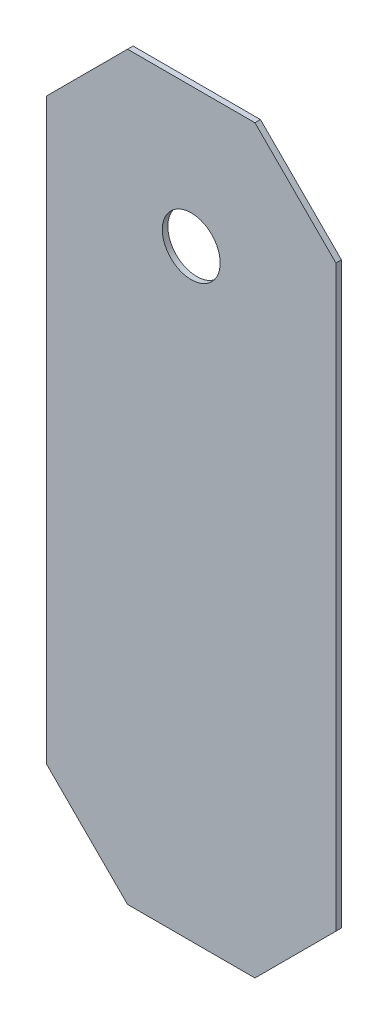
ISO-10303-21;
HEADER;
FILE_DESCRIPTION(('STEP AP214'),'2;1');
FILE_NAME('part.step','',(''),(''),'','','');
FILE_SCHEMA(('AUTOMOTIVE_DESIGN { 1 0 10303 214 1 1 1 1 }'));
ENDSEC;
DATA;
#1=APPLICATION_CONTEXT('core data for automotive mechanical design processes');
#2=APPLICATION_PROTOCOL_DEFINITION('international standard','automotive_design',2000,#1);
#3=PRODUCT_CONTEXT('',#1,'mechanical');
#4=PRODUCT('Part','Part','',(#3));
#5=PRODUCT_RELATED_PRODUCT_CATEGORY('part','',(#4));
#6=PRODUCT_DEFINITION_FORMATION('','',#4);
#7=PRODUCT_DEFINITION_CONTEXT('part definition',#1,'design');
#8=PRODUCT_DEFINITION('design','',#6,#7);
#9=PRODUCT_DEFINITION_SHAPE('','',#8);
#10=(LENGTH_UNIT() NAMED_UNIT(*) SI_UNIT(.MILLI.,.METRE.));
#11=(NAMED_UNIT(*) PLANE_ANGLE_UNIT() SI_UNIT($,.RADIAN.));
#12=(NAMED_UNIT(*) SI_UNIT($,.STERADIAN.) SOLID_ANGLE_UNIT());
#13=UNCERTAINTY_MEASURE_WITH_UNIT(LENGTH_MEASURE(1.E-05),#10,'distance_accuracy_value','');
#14=(GEOMETRIC_REPRESENTATION_CONTEXT(3) GLOBAL_UNCERTAINTY_ASSIGNED_CONTEXT((#13)) GLOBAL_UNIT_ASSIGNED_CONTEXT((#10,
#11,#12)) REPRESENTATION_CONTEXT('',''));
#15=CARTESIAN_POINT('',(0.,0.,0.));
#16=DIRECTION('',(0.,0.,1.));
#17=DIRECTION('',(1.,0.,0.));
#18=AXIS2_PLACEMENT_3D('',#15,#16,#17);
#19=CARTESIAN_POINT('',(-105.,640.774079522774,4.));
#20=DIRECTION('',(0.,0.,1.));
#21=DIRECTION('',(1.,0.,0.));
#22=AXIS2_PLACEMENT_3D('',#19,#20,#21);
#23=PLANE('',#22);
#24=DIRECTION('',(0.,-1.,0.));
#25=VECTOR('',#24,1.);
#26=CARTESIAN_POINT('',(-105.,539.996445797992,4.));
#27=LINE('',#26,#25);
#28=CARTESIAN_POINT('',(-105.,581.996445797992,4.));
#29=VERTEX_POINT('',#28);
#30=CARTESIAN_POINT('',(-105.,161.993882509536,4.));
#31=VERTEX_POINT('',#30);
#32=EDGE_CURVE('E90',#29,#31,#27,.T.);
#33=ORIENTED_EDGE('',*,*,#32,.T.);
#34=DIRECTION('',(0.707106781186548,-0.707106781186547,0.));
#35=VECTOR('',#34,1.);
#36=CARTESIAN_POINT('',(-105.,161.993882509536,4.));
#37=LINE('',#36,#35);
#38=CARTESIAN_POINT('',(-46.2223662752187,103.216248784755,4.));
#39=VERTEX_POINT('',#38);
#40=EDGE_CURVE('E175',#31,#39,#37,.T.);
#41=ORIENTED_EDGE('',*,*,#40,.T.);
#42=DIRECTION('',(1.,0.,0.));
#43=VECTOR('',#42,1.);
#44=CARTESIAN_POINT('',(46.2223662752186,103.216248784755,4.));
#45=LINE('',#44,#43);
#46=CARTESIAN_POINT('',(46.2223662752186,103.216248784755,4.));
#47=VERTEX_POINT('',#46);
#48=EDGE_CURVE('E159',#39,#47,#45,.T.);
#49=ORIENTED_EDGE('',*,*,#48,.T.);
#50=DIRECTION('',(0.707106781186548,0.707106781186547,0.));
#51=VECTOR('',#50,1.);
#52=CARTESIAN_POINT('',(105.,161.993882509536,4.));
#53=LINE('',#52,#51);
#54=CARTESIAN_POINT('',(105.,161.993882509536,4.));
#55=VERTEX_POINT('',#54);
#56=EDGE_CURVE('E171',#47,#55,#53,.T.);
#57=ORIENTED_EDGE('',*,*,#56,.T.);
#58=DIRECTION('',(0.,1.,0.));
#59=VECTOR('',#58,1.);
#60=CARTESIAN_POINT('',(105.,203.993882509536,4.));
#61=LINE('',#60,#59);
#62=CARTESIAN_POINT('',(105.,581.996445797992,4.));
#63=VERTEX_POINT('',#62);
#64=EDGE_CURVE('E110',#55,#63,#61,.T.);
#65=ORIENTED_EDGE('',*,*,#64,.T.);
#66=DIRECTION('',(-0.707106781186548,0.707106781186547,0.));
#67=VECTOR('',#66,1.);
#68=CARTESIAN_POINT('',(105.,581.996445797992,4.));
#69=LINE('',#68,#67);
#70=CARTESIAN_POINT('',(46.2223662752186,640.774079522774,4.));
#71=VERTEX_POINT('',#70);
#72=EDGE_CURVE('E104',#63,#71,#69,.T.);
#73=ORIENTED_EDGE('',*,*,#72,.T.);
#74=DIRECTION('',(-1.,0.,0.));
#75=VECTOR('',#74,1.);
#76=CARTESIAN_POINT('',(46.2223662752186,640.774079522774,4.));
#77=LINE('',#76,#75);
#78=CARTESIAN_POINT('',(-46.2223662752187,640.774079522774,4.));
#79=VERTEX_POINT('',#78);
#80=EDGE_CURVE('E108',#71,#79,#77,.T.);
#81=ORIENTED_EDGE('',*,*,#80,.T.);
#82=DIRECTION('',(-0.707106781186548,-0.707106781186547,0.));
#83=VECTOR('',#82,1.);
#84=CARTESIAN_POINT('',(-105.,581.996445797992,4.));
#85=LINE('',#84,#83);
#86=EDGE_CURVE('E48',#79,#29,#85,.T.);
#87=ORIENTED_EDGE('',*,*,#86,.T.);
#88=EDGE_LOOP('',(#33,#41,#49,#57,#65,#73,#81,#87));
#89=FACE_BOUND('',#88,.T.);
#90=CARTESIAN_POINT('',(0.,539.996445797992,4.));
#91=DIRECTION('',(0.,0.,1.));
#92=DIRECTION('',(1.,0.,0.));
#93=AXIS2_PLACEMENT_3D('',#90,#91,#92);
#94=CIRCLE('',#93,21.);
#95=CARTESIAN_POINT('',(21.,539.996445797992,4.));
#96=VERTEX_POINT('',#95);
#97=EDGE_CURVE('E130',#96,#96,#94,.T.);
#98=ORIENTED_EDGE('',*,*,#97,.F.);
#99=EDGE_LOOP('',(#98));
#100=FACE_BOUND('',#99,.T.);
#101=ADVANCED_FACE('F31',(#89,#100),#23,.T.);
#102=CARTESIAN_POINT('',(-105.,640.774079522774,0.));
#103=DIRECTION('',(0.,0.,1.));
#104=DIRECTION('',(1.,0.,0.));
#105=AXIS2_PLACEMENT_3D('',#102,#103,#104);
#106=PLANE('',#105);
#107=DIRECTION('',(0.,-1.,0.));
#108=VECTOR('',#107,1.);
#109=CARTESIAN_POINT('',(-105.,203.993882509536,0.));
#110=LINE('',#109,#108);
#111=CARTESIAN_POINT('',(-105.,581.996445797992,0.));
#112=VERTEX_POINT('',#111);
#113=CARTESIAN_POINT('',(-105.,161.993882509536,0.));
#114=VERTEX_POINT('',#113);
#115=EDGE_CURVE('E84',#112,#114,#110,.T.);
#116=ORIENTED_EDGE('',*,*,#115,.F.);
#117=DIRECTION('',(-0.707106781186548,-0.707106781186547,0.));
#118=VECTOR('',#117,1.);
#119=CARTESIAN_POINT('',(-105.,581.996445797992,0.));
#120=LINE('',#119,#118);
#121=CARTESIAN_POINT('',(-46.2223662752187,640.774079522774,0.));
#122=VERTEX_POINT('',#121);
#123=EDGE_CURVE('E141',#122,#112,#120,.T.);
#124=ORIENTED_EDGE('',*,*,#123,.F.);
#125=DIRECTION('',(-1.,0.,0.));
#126=VECTOR('',#125,1.);
#127=CARTESIAN_POINT('',(46.2223662752186,640.774079522774,0.));
#128=LINE('',#127,#126);
#129=CARTESIAN_POINT('',(46.2223662752186,640.774079522774,0.));
#130=VERTEX_POINT('',#129);
#131=EDGE_CURVE('E77',#130,#122,#128,.T.);
#132=ORIENTED_EDGE('',*,*,#131,.F.);
#133=DIRECTION('',(-0.707106781186548,0.707106781186547,0.));
#134=VECTOR('',#133,1.);
#135=CARTESIAN_POINT('',(105.,581.996445797992,0.));
#136=LINE('',#135,#134);
#137=CARTESIAN_POINT('',(105.,581.996445797992,0.));
#138=VERTEX_POINT('',#137);
#139=EDGE_CURVE('E118',#138,#130,#136,.T.);
#140=ORIENTED_EDGE('',*,*,#139,.F.);
#141=DIRECTION('',(0.,1.,0.));
#142=VECTOR('',#141,1.);
#143=CARTESIAN_POINT('',(105.,539.996445797992,0.));
#144=LINE('',#143,#142);
#145=CARTESIAN_POINT('',(105.,161.993882509536,0.));
#146=VERTEX_POINT('',#145);
#147=EDGE_CURVE('E137',#146,#138,#144,.T.);
#148=ORIENTED_EDGE('',*,*,#147,.F.);
#149=DIRECTION('',(0.707106781186548,0.707106781186547,0.));
#150=VECTOR('',#149,1.);
#151=CARTESIAN_POINT('',(105.,161.993882509536,0.));
#152=LINE('',#151,#150);
#153=CARTESIAN_POINT('',(46.2223662752186,103.216248784755,0.));
#154=VERTEX_POINT('',#153);
#155=EDGE_CURVE('E134',#154,#146,#152,.T.);
#156=ORIENTED_EDGE('',*,*,#155,.F.);
#157=DIRECTION('',(1.,0.,0.));
#158=VECTOR('',#157,1.);
#159=CARTESIAN_POINT('',(46.2223662752186,103.216248784755,0.));
#160=LINE('',#159,#158);
#161=CARTESIAN_POINT('',(-46.2223662752187,103.216248784755,0.));
#162=VERTEX_POINT('',#161);
#163=EDGE_CURVE('E132',#162,#154,#160,.T.);
#164=ORIENTED_EDGE('',*,*,#163,.F.);
#165=DIRECTION('',(0.707106781186548,-0.707106781186547,0.));
#166=VECTOR('',#165,1.);
#167=CARTESIAN_POINT('',(-105.,161.993882509536,0.));
#168=LINE('',#167,#166);
#169=EDGE_CURVE('E129',#114,#162,#168,.T.);
#170=ORIENTED_EDGE('',*,*,#169,.F.);
#171=EDGE_LOOP('',(#116,#124,#132,#140,#148,#156,#164,#170));
#172=FACE_BOUND('',#171,.T.);
#173=CARTESIAN_POINT('',(0.,539.996445797992,0.));
#174=DIRECTION('',(0.,0.,1.));
#175=DIRECTION('',(1.,0.,0.));
#176=AXIS2_PLACEMENT_3D('',#173,#174,#175);
#177=CIRCLE('',#176,21.);
#178=CARTESIAN_POINT('',(21.,539.996445797992,0.));
#179=VERTEX_POINT('',#178);
#180=EDGE_CURVE('E178',#179,#179,#177,.T.);
#181=ORIENTED_EDGE('',*,*,#180,.T.);
#182=EDGE_LOOP('',(#181));
#183=FACE_BOUND('',#182,.T.);
#184=ADVANCED_FACE('F163',(#172,#183),#106,.F.);
#185=CARTESIAN_POINT('',(-105.,203.993882509536,4.));
#186=DIRECTION('',(1.,0.,0.));
#187=DIRECTION('',(0.,1.,0.));
#188=AXIS2_PLACEMENT_3D('',#185,#186,#187);
#189=PLANE('',#188);
#190=ORIENTED_EDGE('',*,*,#115,.T.);
#191=DIRECTION('',(0.,0.,-1.));
#192=VECTOR('',#191,1.);
#193=CARTESIAN_POINT('',(-105.,161.993882509536,4.));
#194=LINE('',#193,#192);
#195=EDGE_CURVE('E11',#31,#114,#194,.T.);
#196=ORIENTED_EDGE('',*,*,#195,.F.);
#197=ORIENTED_EDGE('',*,*,#32,.F.);
#198=DIRECTION('',(0.,0.,-1.));
#199=VECTOR('',#198,1.);
#200=CARTESIAN_POINT('',(-105.,581.996445797992,4.));
#201=LINE('',#200,#199);
#202=EDGE_CURVE('E124',#29,#112,#201,.T.);
#203=ORIENTED_EDGE('',*,*,#202,.T.);
#204=EDGE_LOOP('',(#190,#196,#197,#203));
#205=FACE_BOUND('',#204,.T.);
#206=ADVANCED_FACE('F33',(#205),#189,.F.);
#207=CARTESIAN_POINT('',(-105.,161.993882509536,4.));
#208=DIRECTION('',(0.707106781186547,0.707106781186548,0.));
#209=DIRECTION('',(-0.707106781186548,0.707106781186547,0.));
#210=AXIS2_PLACEMENT_3D('',#207,#208,#209);
#211=PLANE('',#210);
#212=ORIENTED_EDGE('',*,*,#169,.T.);
#213=DIRECTION('',(0.,0.,-1.));
#214=VECTOR('',#213,1.);
#215=CARTESIAN_POINT('',(-46.2223662752187,103.216248784755,4.));
#216=LINE('',#215,#214);
#217=EDGE_CURVE('E40',#39,#162,#216,.T.);
#218=ORIENTED_EDGE('',*,*,#217,.F.);
#219=ORIENTED_EDGE('',*,*,#40,.F.);
#220=ORIENTED_EDGE('',*,*,#195,.T.);
#221=EDGE_LOOP('',(#212,#218,#219,#220));
#222=FACE_BOUND('',#221,.T.);
#223=ADVANCED_FACE('F207',(#222),#211,.F.);
#224=CARTESIAN_POINT('',(46.2223662752186,103.216248784755,4.));
#225=DIRECTION('',(0.,1.,0.));
#226=DIRECTION('',(0.,0.,1.));
#227=AXIS2_PLACEMENT_3D('',#224,#225,#226);
#228=PLANE('',#227);
#229=ORIENTED_EDGE('',*,*,#163,.T.);
#230=DIRECTION('',(0.,0.,-1.));
#231=VECTOR('',#230,1.);
#232=CARTESIAN_POINT('',(46.2223662752186,103.216248784755,4.));
#233=LINE('',#232,#231);
#234=EDGE_CURVE('E150',#47,#154,#233,.T.);
#235=ORIENTED_EDGE('',*,*,#234,.F.);
#236=ORIENTED_EDGE('',*,*,#48,.F.);
#237=ORIENTED_EDGE('',*,*,#217,.T.);
#238=EDGE_LOOP('',(#229,#235,#236,#237));
#239=FACE_BOUND('',#238,.T.);
#240=ADVANCED_FACE('F157',(#239),#228,.F.);
#241=CARTESIAN_POINT('',(105.,161.993882509536,4.));
#242=DIRECTION('',(-0.707106781186547,0.707106781186548,0.));
#243=DIRECTION('',(-0.707106781186548,-0.707106781186547,0.));
#244=AXIS2_PLACEMENT_3D('',#241,#242,#243);
#245=PLANE('',#244);
#246=ORIENTED_EDGE('',*,*,#155,.T.);
#247=DIRECTION('',(0.,0.,-1.));
#248=VECTOR('',#247,1.);
#249=CARTESIAN_POINT('',(105.,161.993882509536,4.));
#250=LINE('',#249,#248);
#251=EDGE_CURVE('E147',#55,#146,#250,.T.);
#252=ORIENTED_EDGE('',*,*,#251,.F.);
#253=ORIENTED_EDGE('',*,*,#56,.F.);
#254=ORIENTED_EDGE('',*,*,#234,.T.);
#255=EDGE_LOOP('',(#246,#252,#253,#254));
#256=FACE_BOUND('',#255,.T.);
#257=ADVANCED_FACE('F167',(#256),#245,.F.);
#258=CARTESIAN_POINT('',(105.,539.996445797992,4.));
#259=DIRECTION('',(-1.,0.,0.));
#260=DIRECTION('',(0.,-1.,0.));
#261=AXIS2_PLACEMENT_3D('',#258,#259,#260);
#262=PLANE('',#261);
#263=ORIENTED_EDGE('',*,*,#147,.T.);
#264=DIRECTION('',(0.,0.,-1.));
#265=VECTOR('',#264,1.);
#266=CARTESIAN_POINT('',(105.,581.996445797992,4.));
#267=LINE('',#266,#265);
#268=EDGE_CURVE('E119',#63,#138,#267,.T.);
#269=ORIENTED_EDGE('',*,*,#268,.F.);
#270=ORIENTED_EDGE('',*,*,#64,.F.);
#271=ORIENTED_EDGE('',*,*,#251,.T.);
#272=EDGE_LOOP('',(#263,#269,#270,#271));
#273=FACE_BOUND('',#272,.T.);
#274=ADVANCED_FACE('F170',(#273),#262,.F.);
#275=CARTESIAN_POINT('',(105.,581.996445797992,4.));
#276=DIRECTION('',(-0.707106781186547,-0.707106781186548,0.));
#277=DIRECTION('',(0.707106781186548,-0.707106781186547,0.));
#278=AXIS2_PLACEMENT_3D('',#275,#276,#277);
#279=PLANE('',#278);
#280=ORIENTED_EDGE('',*,*,#139,.T.);
#281=DIRECTION('',(0.,0.,-1.));
#282=VECTOR('',#281,1.);
#283=CARTESIAN_POINT('',(46.2223662752186,640.774079522774,4.));
#284=LINE('',#283,#282);
#285=EDGE_CURVE('E115',#71,#130,#284,.T.);
#286=ORIENTED_EDGE('',*,*,#285,.F.);
#287=ORIENTED_EDGE('',*,*,#72,.F.);
#288=ORIENTED_EDGE('',*,*,#268,.T.);
#289=EDGE_LOOP('',(#280,#286,#287,#288));
#290=FACE_BOUND('',#289,.T.);
#291=ADVANCED_FACE('F116',(#290),#279,.F.);
#292=CARTESIAN_POINT('',(46.2223662752186,640.774079522774,4.));
#293=DIRECTION('',(0.,-1.,0.));
#294=DIRECTION('',(0.,0.,-1.));
#295=AXIS2_PLACEMENT_3D('',#292,#293,#294);
#296=PLANE('',#295);
#297=ORIENTED_EDGE('',*,*,#131,.T.);
#298=DIRECTION('',(0.,0.,-1.));
#299=VECTOR('',#298,1.);
#300=CARTESIAN_POINT('',(-46.2223662752187,640.774079522774,4.));
#301=LINE('',#300,#299);
#302=EDGE_CURVE('E120',#79,#122,#301,.T.);
#303=ORIENTED_EDGE('',*,*,#302,.F.);
#304=ORIENTED_EDGE('',*,*,#80,.F.);
#305=ORIENTED_EDGE('',*,*,#285,.T.);
#306=EDGE_LOOP('',(#297,#303,#304,#305));
#307=FACE_BOUND('',#306,.T.);
#308=ADVANCED_FACE('F122',(#307),#296,.F.);
#309=CARTESIAN_POINT('',(-105.,581.996445797992,4.));
#310=DIRECTION('',(0.707106781186547,-0.707106781186548,0.));
#311=DIRECTION('',(0.707106781186548,0.707106781186547,0.));
#312=AXIS2_PLACEMENT_3D('',#309,#310,#311);
#313=PLANE('',#312);
#314=ORIENTED_EDGE('',*,*,#123,.T.);
#315=ORIENTED_EDGE('',*,*,#202,.F.);
#316=ORIENTED_EDGE('',*,*,#86,.F.);
#317=ORIENTED_EDGE('',*,*,#302,.T.);
#318=EDGE_LOOP('',(#314,#315,#316,#317));
#319=FACE_BOUND('',#318,.T.);
#320=ADVANCED_FACE('F194',(#319),#313,.F.);
#321=CARTESIAN_POINT('',(0.,539.996445797992,4.));
#322=DIRECTION('',(0.,0.,-1.));
#323=DIRECTION('',(-1.,0.,0.));
#324=AXIS2_PLACEMENT_3D('',#321,#322,#323);
#325=CYLINDRICAL_SURFACE('',#324,21.);
#326=ORIENTED_EDGE('',*,*,#97,.T.);
#327=EDGE_LOOP('',(#326));
#328=FACE_BOUND('',#327,.T.);
#329=ORIENTED_EDGE('',*,*,#180,.F.);
#330=EDGE_LOOP('',(#329));
#331=FACE_BOUND('',#330,.T.);
#332=ADVANCED_FACE('F184',(#328,#331),#325,.F.);
#333=CLOSED_SHELL('',(#101,#184,#206,#223,#240,#257,#274,#291,#308,#320,#332));
#334=MANIFOLD_SOLID_BREP('B2',#333);
#335=ADVANCED_BREP_SHAPE_REPRESENTATION('',(#18,#334),#14);
#336=SHAPE_DEFINITION_REPRESENTATION(#9,#335);
ENDSEC;
END-ISO-10303-21;
